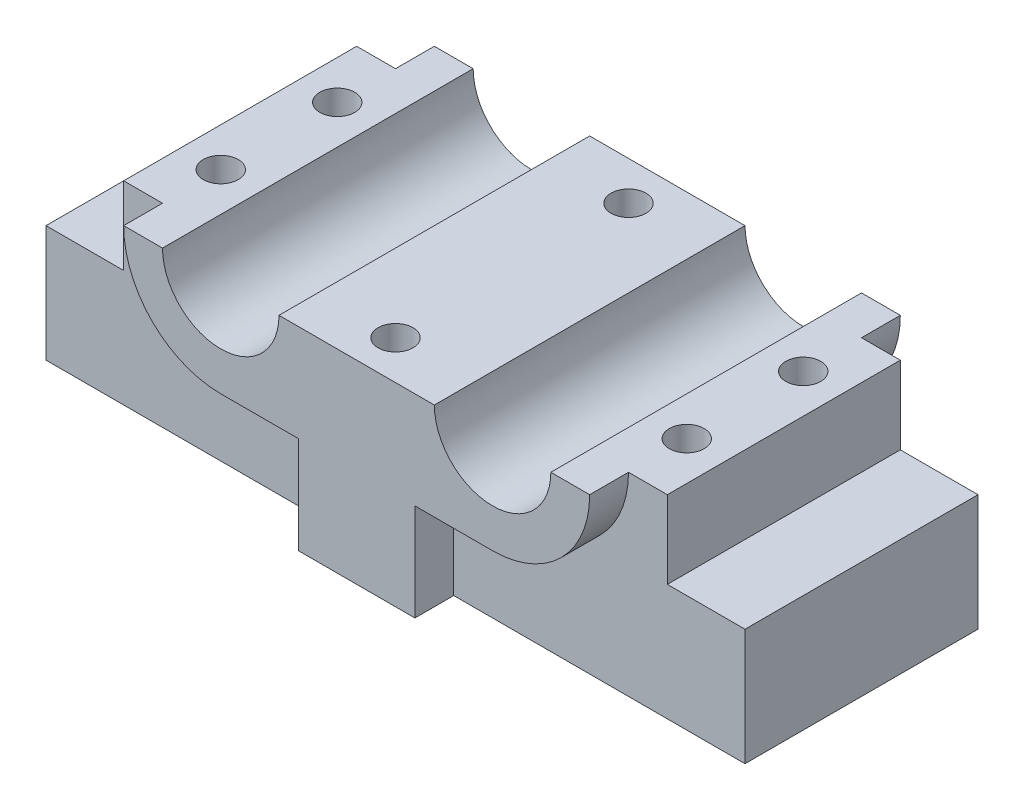
ISO-10303-21;
HEADER;
FILE_DESCRIPTION(('STEP AP214'),'2;1');
FILE_NAME('part.step','',(''),(''),'','','');
FILE_SCHEMA(('AUTOMOTIVE_DESIGN { 1 0 10303 214 1 1 1 1 }'));
ENDSEC;
DATA;
#1=APPLICATION_CONTEXT('core data for automotive mechanical design processes');
#2=APPLICATION_PROTOCOL_DEFINITION('international standard','automotive_design',2000,#1);
#3=PRODUCT_CONTEXT('',#1,'mechanical');
#4=PRODUCT('Part','Part','',(#3));
#5=PRODUCT_RELATED_PRODUCT_CATEGORY('part','',(#4));
#6=PRODUCT_DEFINITION_FORMATION('','',#4);
#7=PRODUCT_DEFINITION_CONTEXT('part definition',#1,'design');
#8=PRODUCT_DEFINITION('design','',#6,#7);
#9=PRODUCT_DEFINITION_SHAPE('','',#8);
#10=(LENGTH_UNIT() NAMED_UNIT(*) SI_UNIT(.MILLI.,.METRE.));
#11=(NAMED_UNIT(*) PLANE_ANGLE_UNIT() SI_UNIT($,.RADIAN.));
#12=(NAMED_UNIT(*) SI_UNIT($,.STERADIAN.) SOLID_ANGLE_UNIT());
#13=UNCERTAINTY_MEASURE_WITH_UNIT(LENGTH_MEASURE(1.E-05),#10,'distance_accuracy_value','');
#14=(GEOMETRIC_REPRESENTATION_CONTEXT(3) GLOBAL_UNCERTAINTY_ASSIGNED_CONTEXT((#13)) GLOBAL_UNIT_ASSIGNED_CONTEXT((#10,
#11,#12)) REPRESENTATION_CONTEXT('',''));
#15=CARTESIAN_POINT('',(0.,0.,0.));
#16=DIRECTION('',(0.,0.,1.));
#17=DIRECTION('',(1.,0.,0.));
#18=AXIS2_PLACEMENT_3D('',#15,#16,#17);
#19=CARTESIAN_POINT('',(-45.,12.5,20.));
#20=DIRECTION('',(0.,-1.,0.));
#21=DIRECTION('',(0.,0.,-1.));
#22=AXIS2_PLACEMENT_3D('',#19,#20,#21);
#23=PLANE('',#22);
#24=DIRECTION('',(-1.,0.,0.));
#25=VECTOR('',#24,1.);
#26=CARTESIAN_POINT('',(-45.,12.5,-20.));
#27=LINE('',#26,#25);
#28=CARTESIAN_POINT('',(30.,12.5,-20.));
#29=VERTEX_POINT('',#28);
#30=CARTESIAN_POINT('',(25.,12.5,-20.));
#31=VERTEX_POINT('',#30);
#32=EDGE_CURVE('E237',#29,#31,#27,.T.);
#33=ORIENTED_EDGE('',*,*,#32,.T.);
#34=DIRECTION('',(0.,0.,1.));
#35=VECTOR('',#34,1.);
#36=CARTESIAN_POINT('',(25.,12.5,-20.));
#37=LINE('',#36,#35);
#38=CARTESIAN_POINT('',(25.,12.5,20.));
#39=VERTEX_POINT('',#38);
#40=EDGE_CURVE('E222',#31,#39,#37,.T.);
#41=ORIENTED_EDGE('',*,*,#40,.T.);
#42=DIRECTION('',(-1.,0.,0.));
#43=VECTOR('',#42,1.);
#44=CARTESIAN_POINT('',(-45.,12.5,20.));
#45=LINE('',#44,#43);
#46=CARTESIAN_POINT('',(30.,12.5,20.));
#47=VERTEX_POINT('',#46);
#48=EDGE_CURVE('E279',#47,#39,#45,.T.);
#49=ORIENTED_EDGE('',*,*,#48,.F.);
#50=DIRECTION('',(0.,0.,1.));
#51=VECTOR('',#50,1.);
#52=CARTESIAN_POINT('',(30.,12.5,15.));
#53=LINE('',#52,#51);
#54=CARTESIAN_POINT('',(30.,12.5,15.));
#55=VERTEX_POINT('',#54);
#56=EDGE_CURVE('E374',#55,#47,#53,.T.);
#57=ORIENTED_EDGE('',*,*,#56,.F.);
#58=DIRECTION('',(-1.,0.,0.));
#59=VECTOR('',#58,1.);
#60=CARTESIAN_POINT('',(35.,12.5,15.));
#61=LINE('',#60,#59);
#62=CARTESIAN_POINT('',(35.,12.5,15.));
#63=VERTEX_POINT('',#62);
#64=EDGE_CURVE('E268',#63,#55,#61,.T.);
#65=ORIENTED_EDGE('',*,*,#64,.F.);
#66=DIRECTION('',(0.,0.,1.));
#67=VECTOR('',#66,1.);
#68=CARTESIAN_POINT('',(35.,12.5,-20.));
#69=LINE('',#68,#67);
#70=CARTESIAN_POINT('',(35.,12.5,-15.));
#71=VERTEX_POINT('',#70);
#72=EDGE_CURVE('E272',#71,#63,#69,.T.);
#73=ORIENTED_EDGE('',*,*,#72,.F.);
#74=DIRECTION('',(-1.,0.,0.));
#75=VECTOR('',#74,1.);
#76=CARTESIAN_POINT('',(35.,12.5,-15.));
#77=LINE('',#76,#75);
#78=CARTESIAN_POINT('',(30.,12.5,-15.));
#79=VERTEX_POINT('',#78);
#80=EDGE_CURVE('E328',#71,#79,#77,.T.);
#81=ORIENTED_EDGE('',*,*,#80,.T.);
#82=DIRECTION('',(0.,0.,-1.));
#83=VECTOR('',#82,1.);
#84=CARTESIAN_POINT('',(30.,12.5,-15.));
#85=LINE('',#84,#83);
#86=EDGE_CURVE('E246',#79,#29,#85,.T.);
#87=ORIENTED_EDGE('',*,*,#86,.T.);
#88=EDGE_LOOP('',(#33,#41,#49,#57,#65,#73,#81,#87));
#89=FACE_BOUND('',#88,.T.);
#90=CARTESIAN_POINT('',(30.,12.5,7.5));
#91=DIRECTION('',(0.,1.,0.));
#92=DIRECTION('',(0.,0.,1.));
#93=AXIS2_PLACEMENT_3D('',#90,#91,#92);
#94=CIRCLE('',#93,2.24999999999998);
#95=CARTESIAN_POINT('',(30.,12.5,9.74999999999998));
#96=VERTEX_POINT('',#95);
#97=EDGE_CURVE('E566',#96,#96,#94,.T.);
#98=ORIENTED_EDGE('',*,*,#97,.F.);
#99=EDGE_LOOP('',(#98));
#100=FACE_BOUND('',#99,.T.);
#101=CARTESIAN_POINT('',(30.,12.5,-7.5));
#102=DIRECTION('',(0.,1.,0.));
#103=DIRECTION('',(0.,0.,1.));
#104=AXIS2_PLACEMENT_3D('',#101,#102,#103);
#105=CIRCLE('',#104,2.24999999999999);
#106=CARTESIAN_POINT('',(30.,12.5,-5.25000000000001));
#107=VERTEX_POINT('',#106);
#108=EDGE_CURVE('E555',#107,#107,#105,.T.);
#109=ORIENTED_EDGE('',*,*,#108,.F.);
#110=EDGE_LOOP('',(#109));
#111=FACE_BOUND('',#110,.T.);
#112=ADVANCED_FACE('F39',(#89,#100,#111),#23,.F.);
#113=CARTESIAN_POINT('',(0.,12.5,-15.));
#114=DIRECTION('',(0.,1.,0.));
#115=DIRECTION('',(0.,0.,1.));
#116=AXIS2_PLACEMENT_3D('',#113,#114,#115);
#117=CIRCLE('',#116,2.24999999999999);
#118=CARTESIAN_POINT('',(0.,12.5,-12.75));
#119=VERTEX_POINT('',#118);
#120=EDGE_CURVE('E669',#119,#119,#117,.T.);
#121=ORIENTED_EDGE('',*,*,#120,.F.);
#122=EDGE_LOOP('',(#121));
#123=FACE_BOUND('',#122,.T.);
#124=CARTESIAN_POINT('',(0.,12.5,15.));
#125=DIRECTION('',(0.,1.,0.));
#126=DIRECTION('',(0.,0.,1.));
#127=AXIS2_PLACEMENT_3D('',#124,#125,#126);
#128=CIRCLE('',#127,2.24999999999999);
#129=CARTESIAN_POINT('',(0.,12.5,17.25));
#130=VERTEX_POINT('',#129);
#131=EDGE_CURVE('E663',#130,#130,#128,.T.);
#132=ORIENTED_EDGE('',*,*,#131,.F.);
#133=EDGE_LOOP('',(#132));
#134=FACE_BOUND('',#133,.T.);
#135=CARTESIAN_POINT('',(9.99999999999999,12.5,20.));
#136=VERTEX_POINT('',#135);
#137=CARTESIAN_POINT('',(-10.,12.5,20.));
#138=VERTEX_POINT('',#137);
#139=EDGE_CURVE('E281',#136,#138,#45,.T.);
#140=ORIENTED_EDGE('',*,*,#139,.F.);
#141=DIRECTION('',(0.,0.,1.));
#142=VECTOR('',#141,1.);
#143=CARTESIAN_POINT('',(10.,12.5,-20.));
#144=LINE('',#143,#142);
#145=CARTESIAN_POINT('',(10.,12.5,-20.));
#146=VERTEX_POINT('',#145);
#147=EDGE_CURVE('E62',#146,#136,#144,.T.);
#148=ORIENTED_EDGE('',*,*,#147,.F.);
#149=CARTESIAN_POINT('',(-10.,12.5,-20.));
#150=VERTEX_POINT('',#149);
#151=EDGE_CURVE('E240',#146,#150,#27,.T.);
#152=ORIENTED_EDGE('',*,*,#151,.T.);
#153=DIRECTION('',(0.,0.,1.));
#154=VECTOR('',#153,1.);
#155=CARTESIAN_POINT('',(-10.,12.5,-20.));
#156=LINE('',#155,#154);
#157=EDGE_CURVE('E449',#150,#138,#156,.T.);
#158=ORIENTED_EDGE('',*,*,#157,.T.);
#159=EDGE_LOOP('',(#140,#148,#152,#158));
#160=FACE_BOUND('',#159,.T.);
#161=ADVANCED_FACE('F448',(#123,#134,#160),#23,.F.);
#162=CARTESIAN_POINT('',(-30.,12.5,-7.5));
#163=DIRECTION('',(0.,1.,0.));
#164=DIRECTION('',(0.,0.,1.));
#165=AXIS2_PLACEMENT_3D('',#162,#163,#164);
#166=CIRCLE('',#165,2.24999999999999);
#167=CARTESIAN_POINT('',(-30.,12.5,-5.25000000000001));
#168=VERTEX_POINT('',#167);
#169=EDGE_CURVE('E546',#168,#168,#166,.T.);
#170=ORIENTED_EDGE('',*,*,#169,.F.);
#171=EDGE_LOOP('',(#170));
#172=FACE_BOUND('',#171,.T.);
#173=CARTESIAN_POINT('',(-30.,12.5,7.5));
#174=DIRECTION('',(0.,1.,0.));
#175=DIRECTION('',(0.,0.,1.));
#176=AXIS2_PLACEMENT_3D('',#173,#174,#175);
#177=CIRCLE('',#176,2.24999999999999);
#178=CARTESIAN_POINT('',(-30.,12.5,9.74999999999999));
#179=VERTEX_POINT('',#178);
#180=EDGE_CURVE('E549',#179,#179,#177,.T.);
#181=ORIENTED_EDGE('',*,*,#180,.F.);
#182=EDGE_LOOP('',(#181));
#183=FACE_BOUND('',#182,.T.);
#184=CARTESIAN_POINT('',(-25.,12.5,20.));
#185=VERTEX_POINT('',#184);
#186=CARTESIAN_POINT('',(-30.,12.5,20.));
#187=VERTEX_POINT('',#186);
#188=EDGE_CURVE('E251',#185,#187,#45,.T.);
#189=ORIENTED_EDGE('',*,*,#188,.F.);
#190=DIRECTION('',(0.,0.,1.));
#191=VECTOR('',#190,1.);
#192=CARTESIAN_POINT('',(-25.,12.5,-20.));
#193=LINE('',#192,#191);
#194=CARTESIAN_POINT('',(-25.,12.5,-20.));
#195=VERTEX_POINT('',#194);
#196=EDGE_CURVE('E54',#195,#185,#193,.T.);
#197=ORIENTED_EDGE('',*,*,#196,.F.);
#198=CARTESIAN_POINT('',(-30.,12.5,-20.));
#199=VERTEX_POINT('',#198);
#200=EDGE_CURVE('E249',#195,#199,#27,.T.);
#201=ORIENTED_EDGE('',*,*,#200,.T.);
#202=DIRECTION('',(0.,0.,-1.));
#203=VECTOR('',#202,1.);
#204=CARTESIAN_POINT('',(-30.,12.5,-15.));
#205=LINE('',#204,#203);
#206=CARTESIAN_POINT('',(-30.,12.5,-15.));
#207=VERTEX_POINT('',#206);
#208=EDGE_CURVE('E383',#207,#199,#205,.T.);
#209=ORIENTED_EDGE('',*,*,#208,.F.);
#210=DIRECTION('',(-1.,0.,0.));
#211=VECTOR('',#210,1.);
#212=CARTESIAN_POINT('',(0.,12.5,-15.));
#213=LINE('',#212,#211);
#214=CARTESIAN_POINT('',(-35.,12.5,-15.));
#215=VERTEX_POINT('',#214);
#216=EDGE_CURVE('E479',#207,#215,#213,.T.);
#217=ORIENTED_EDGE('',*,*,#216,.T.);
#218=DIRECTION('',(0.,0.,1.));
#219=VECTOR('',#218,1.);
#220=CARTESIAN_POINT('',(-35.,12.5,-20.));
#221=LINE('',#220,#219);
#222=CARTESIAN_POINT('',(-35.,12.5,15.));
#223=VERTEX_POINT('',#222);
#224=EDGE_CURVE('E254',#215,#223,#221,.T.);
#225=ORIENTED_EDGE('',*,*,#224,.T.);
#226=DIRECTION('',(-1.,0.,0.));
#227=VECTOR('',#226,1.);
#228=CARTESIAN_POINT('',(0.,12.5,15.));
#229=LINE('',#228,#227);
#230=CARTESIAN_POINT('',(-30.,12.5,15.));
#231=VERTEX_POINT('',#230);
#232=EDGE_CURVE('E339',#231,#223,#229,.T.);
#233=ORIENTED_EDGE('',*,*,#232,.F.);
#234=DIRECTION('',(0.,0.,1.));
#235=VECTOR('',#234,1.);
#236=CARTESIAN_POINT('',(-30.,12.5,15.));
#237=LINE('',#236,#235);
#238=EDGE_CURVE('E357',#231,#187,#237,.T.);
#239=ORIENTED_EDGE('',*,*,#238,.T.);
#240=EDGE_LOOP('',(#189,#197,#201,#209,#217,#225,#233,#239));
#241=FACE_BOUND('',#240,.T.);
#242=ADVANCED_FACE('F442',(#172,#183,#241),#23,.F.);
#243=CARTESIAN_POINT('',(-45.,12.5,20.));
#244=DIRECTION('',(1.,0.,0.));
#245=DIRECTION('',(0.,1.,0.));
#246=AXIS2_PLACEMENT_3D('',#243,#244,#245);
#247=PLANE('',#246);
#248=DIRECTION('',(0.,-1.,0.));
#249=VECTOR('',#248,1.);
#250=CARTESIAN_POINT('',(-45.,0.,-15.));
#251=LINE('',#250,#249);
#252=CARTESIAN_POINT('',(-45.,2.49999999999999,-15.));
#253=VERTEX_POINT('',#252);
#254=CARTESIAN_POINT('',(-45.,-12.5,-15.));
#255=VERTEX_POINT('',#254);
#256=EDGE_CURVE('E470',#253,#255,#251,.T.);
#257=ORIENTED_EDGE('',*,*,#256,.T.);
#258=DIRECTION('',(0.,0.,-1.));
#259=VECTOR('',#258,1.);
#260=CARTESIAN_POINT('',(-45.,-12.5,20.));
#261=LINE('',#260,#259);
#262=CARTESIAN_POINT('',(-45.,-12.5,15.));
#263=VERTEX_POINT('',#262);
#264=EDGE_CURVE('E11',#263,#255,#261,.T.);
#265=ORIENTED_EDGE('',*,*,#264,.F.);
#266=DIRECTION('',(0.,-1.,0.));
#267=VECTOR('',#266,1.);
#268=CARTESIAN_POINT('',(-45.,0.,15.));
#269=LINE('',#268,#267);
#270=CARTESIAN_POINT('',(-45.,2.49999999999999,15.));
#271=VERTEX_POINT('',#270);
#272=EDGE_CURVE('E348',#271,#263,#269,.T.);
#273=ORIENTED_EDGE('',*,*,#272,.F.);
#274=DIRECTION('',(0.,0.,1.));
#275=VECTOR('',#274,1.);
#276=CARTESIAN_POINT('',(-45.,2.49999999999999,-20.));
#277=LINE('',#276,#275);
#278=EDGE_CURVE('E265',#253,#271,#277,.T.);
#279=ORIENTED_EDGE('',*,*,#278,.F.);
#280=EDGE_LOOP('',(#257,#265,#273,#279));
#281=FACE_BOUND('',#280,.T.);
#282=ADVANCED_FACE('F536',(#281),#247,.F.);
#283=CARTESIAN_POINT('',(-45.,-12.5,20.));
#284=DIRECTION('',(0.,1.,0.));
#285=DIRECTION('',(0.,0.,1.));
#286=AXIS2_PLACEMENT_3D('',#283,#284,#285);
#287=PLANE('',#286);
#288=CARTESIAN_POINT('',(0.,-12.5,-15.));
#289=DIRECTION('',(0.,1.,0.));
#290=DIRECTION('',(0.,0.,1.));
#291=AXIS2_PLACEMENT_3D('',#288,#289,#290);
#292=CIRCLE('',#291,2.25);
#293=CARTESIAN_POINT('',(0.,-12.5,-12.75));
#294=VERTEX_POINT('',#293);
#295=EDGE_CURVE('E650',#294,#294,#292,.T.);
#296=ORIENTED_EDGE('',*,*,#295,.T.);
#297=EDGE_LOOP('',(#296));
#298=FACE_BOUND('',#297,.T.);
#299=CARTESIAN_POINT('',(0.,-12.5,15.));
#300=DIRECTION('',(0.,1.,0.));
#301=DIRECTION('',(0.,0.,1.));
#302=AXIS2_PLACEMENT_3D('',#299,#300,#301);
#303=CIRCLE('',#302,2.25);
#304=CARTESIAN_POINT('',(0.,-12.5,17.25));
#305=VERTEX_POINT('',#304);
#306=EDGE_CURVE('E654',#305,#305,#303,.T.);
#307=ORIENTED_EDGE('',*,*,#306,.T.);
#308=EDGE_LOOP('',(#307));
#309=FACE_BOUND('',#308,.T.);
#310=CARTESIAN_POINT('',(-30.,-12.5,-7.5));
#311=DIRECTION('',(0.,1.,0.));
#312=DIRECTION('',(0.,0.,1.));
#313=AXIS2_PLACEMENT_3D('',#310,#311,#312);
#314=CIRCLE('',#313,2.25);
#315=CARTESIAN_POINT('',(-30.,-12.5,-5.25));
#316=VERTEX_POINT('',#315);
#317=EDGE_CURVE('E552',#316,#316,#314,.T.);
#318=ORIENTED_EDGE('',*,*,#317,.T.);
#319=EDGE_LOOP('',(#318));
#320=FACE_BOUND('',#319,.T.);
#321=CARTESIAN_POINT('',(-30.,-12.5,7.5));
#322=DIRECTION('',(0.,1.,0.));
#323=DIRECTION('',(0.,0.,1.));
#324=AXIS2_PLACEMENT_3D('',#321,#322,#323);
#325=CIRCLE('',#324,2.25);
#326=CARTESIAN_POINT('',(-30.,-12.5,9.75));
#327=VERTEX_POINT('',#326);
#328=EDGE_CURVE('E551',#327,#327,#325,.T.);
#329=ORIENTED_EDGE('',*,*,#328,.T.);
#330=EDGE_LOOP('',(#329));
#331=FACE_BOUND('',#330,.T.);
#332=CARTESIAN_POINT('',(30.,-12.5,-7.5));
#333=DIRECTION('',(0.,1.,0.));
#334=DIRECTION('',(0.,0.,1.));
#335=AXIS2_PLACEMENT_3D('',#332,#333,#334);
#336=CIRCLE('',#335,2.25);
#337=CARTESIAN_POINT('',(30.,-12.5,-5.25));
#338=VERTEX_POINT('',#337);
#339=EDGE_CURVE('E563',#338,#338,#336,.T.);
#340=ORIENTED_EDGE('',*,*,#339,.T.);
#341=EDGE_LOOP('',(#340));
#342=FACE_BOUND('',#341,.T.);
#343=CARTESIAN_POINT('',(30.,-12.5,7.5));
#344=DIRECTION('',(0.,1.,0.));
#345=DIRECTION('',(0.,0.,1.));
#346=AXIS2_PLACEMENT_3D('',#343,#344,#345);
#347=CIRCLE('',#346,2.25);
#348=CARTESIAN_POINT('',(30.,-12.5,9.75));
#349=VERTEX_POINT('',#348);
#350=EDGE_CURVE('E453',#349,#349,#347,.T.);
#351=ORIENTED_EDGE('',*,*,#350,.T.);
#352=EDGE_LOOP('',(#351));
#353=FACE_BOUND('',#352,.T.);
#354=DIRECTION('',(1.,0.,0.));
#355=VECTOR('',#354,1.);
#356=CARTESIAN_POINT('',(0.,-12.5,-15.));
#357=LINE('',#356,#355);
#358=CARTESIAN_POINT('',(-7.5,-12.5,-15.));
#359=VERTEX_POINT('',#358);
#360=EDGE_CURVE('E468',#255,#359,#357,.T.);
#361=ORIENTED_EDGE('',*,*,#360,.T.);
#362=DIRECTION('',(0.,0.,-1.));
#363=VECTOR('',#362,1.);
#364=CARTESIAN_POINT('',(-7.5,-12.5,-15.));
#365=LINE('',#364,#363);
#366=CARTESIAN_POINT('',(-7.5,-12.5,-20.));
#367=VERTEX_POINT('',#366);
#368=EDGE_CURVE('E488',#359,#367,#365,.T.);
#369=ORIENTED_EDGE('',*,*,#368,.T.);
#370=DIRECTION('',(1.,0.,0.));
#371=VECTOR('',#370,1.);
#372=CARTESIAN_POINT('',(-45.,-12.5,-20.));
#373=LINE('',#372,#371);
#374=CARTESIAN_POINT('',(7.5,-12.5,-20.));
#375=VERTEX_POINT('',#374);
#376=EDGE_CURVE('E247',#367,#375,#373,.T.);
#377=ORIENTED_EDGE('',*,*,#376,.T.);
#378=DIRECTION('',(0.,0.,-1.));
#379=VECTOR('',#378,1.);
#380=CARTESIAN_POINT('',(7.5,-12.5,-15.));
#381=LINE('',#380,#379);
#382=CARTESIAN_POINT('',(7.5,-12.5,-15.));
#383=VERTEX_POINT('',#382);
#384=EDGE_CURVE('E306',#383,#375,#381,.T.);
#385=ORIENTED_EDGE('',*,*,#384,.F.);
#386=DIRECTION('',(1.,0.,0.));
#387=VECTOR('',#386,1.);
#388=CARTESIAN_POINT('',(7.5,-12.5,-15.));
#389=LINE('',#388,#387);
#390=CARTESIAN_POINT('',(45.,-12.5,-15.));
#391=VERTEX_POINT('',#390);
#392=EDGE_CURVE('E305',#383,#391,#389,.T.);
#393=ORIENTED_EDGE('',*,*,#392,.T.);
#394=DIRECTION('',(0.,0.,-1.));
#395=VECTOR('',#394,1.);
#396=CARTESIAN_POINT('',(45.,-12.5,20.));
#397=LINE('',#396,#395);
#398=CARTESIAN_POINT('',(45.,-12.5,15.));
#399=VERTEX_POINT('',#398);
#400=EDGE_CURVE('E47',#399,#391,#397,.T.);
#401=ORIENTED_EDGE('',*,*,#400,.F.);
#402=DIRECTION('',(1.,0.,0.));
#403=VECTOR('',#402,1.);
#404=CARTESIAN_POINT('',(7.5,-12.5,15.));
#405=LINE('',#404,#403);
#406=CARTESIAN_POINT('',(7.5,-12.5,15.));
#407=VERTEX_POINT('',#406);
#408=EDGE_CURVE('E302',#407,#399,#405,.T.);
#409=ORIENTED_EDGE('',*,*,#408,.F.);
#410=DIRECTION('',(0.,0.,1.));
#411=VECTOR('',#410,1.);
#412=CARTESIAN_POINT('',(7.5,-12.5,15.));
#413=LINE('',#412,#411);
#414=CARTESIAN_POINT('',(7.5,-12.5,20.));
#415=VERTEX_POINT('',#414);
#416=EDGE_CURVE('E381',#407,#415,#413,.T.);
#417=ORIENTED_EDGE('',*,*,#416,.T.);
#418=DIRECTION('',(1.,0.,0.));
#419=VECTOR('',#418,1.);
#420=CARTESIAN_POINT('',(-45.,-12.5,20.));
#421=LINE('',#420,#419);
#422=CARTESIAN_POINT('',(-7.5,-12.5,20.));
#423=VERTEX_POINT('',#422);
#424=EDGE_CURVE('E280',#423,#415,#421,.T.);
#425=ORIENTED_EDGE('',*,*,#424,.F.);
#426=DIRECTION('',(0.,0.,1.));
#427=VECTOR('',#426,1.);
#428=CARTESIAN_POINT('',(-7.5,-12.5,15.));
#429=LINE('',#428,#427);
#430=CARTESIAN_POINT('',(-7.5,-12.5,15.));
#431=VERTEX_POINT('',#430);
#432=EDGE_CURVE('E370',#431,#423,#429,.T.);
#433=ORIENTED_EDGE('',*,*,#432,.F.);
#434=DIRECTION('',(1.,0.,0.));
#435=VECTOR('',#434,1.);
#436=CARTESIAN_POINT('',(0.,-12.5,15.));
#437=LINE('',#436,#435);
#438=EDGE_CURVE('E350',#263,#431,#437,.T.);
#439=ORIENTED_EDGE('',*,*,#438,.F.);
#440=ORIENTED_EDGE('',*,*,#264,.T.);
#441=EDGE_LOOP('',(#361,#369,#377,#385,#393,#401,#409,#417,#425,#433,#439,#440));
#442=FACE_BOUND('',#441,.T.);
#443=ADVANCED_FACE('F300',(#298,#309,#320,#331,#342,#353,#442),#287,.F.);
#444=CARTESIAN_POINT('',(-35.,12.5,-20.));
#445=DIRECTION('',(1.,0.,0.));
#446=DIRECTION('',(0.,0.,-1.));
#447=AXIS2_PLACEMENT_3D('',#444,#445,#446);
#448=PLANE('',#447);
#449=DIRECTION('',(0.,-1.,0.));
#450=VECTOR('',#449,1.);
#451=CARTESIAN_POINT('',(-35.,0.,-15.));
#452=LINE('',#451,#450);
#453=CARTESIAN_POINT('',(-35.,2.49999999999999,-15.));
#454=VERTEX_POINT('',#453);
#455=EDGE_CURVE('E476',#215,#454,#452,.T.);
#456=ORIENTED_EDGE('',*,*,#455,.T.);
#457=DIRECTION('',(0.,0.,1.));
#458=VECTOR('',#457,1.);
#459=CARTESIAN_POINT('',(-35.,2.49999999999999,-20.));
#460=LINE('',#459,#458);
#461=CARTESIAN_POINT('',(-35.,2.49999999999999,15.));
#462=VERTEX_POINT('',#461);
#463=EDGE_CURVE('E259',#454,#462,#460,.T.);
#464=ORIENTED_EDGE('',*,*,#463,.T.);
#465=DIRECTION('',(0.,-1.,0.));
#466=VECTOR('',#465,1.);
#467=CARTESIAN_POINT('',(-35.,0.,15.));
#468=LINE('',#467,#466);
#469=EDGE_CURVE('E342',#223,#462,#468,.T.);
#470=ORIENTED_EDGE('',*,*,#469,.F.);
#471=ORIENTED_EDGE('',*,*,#224,.F.);
#472=EDGE_LOOP('',(#456,#464,#470,#471));
#473=FACE_BOUND('',#472,.T.);
#474=ADVANCED_FACE('F627',(#473),#448,.F.);
#475=CARTESIAN_POINT('',(-45.,2.49999999999999,-20.));
#476=DIRECTION('',(0.,-1.,0.));
#477=DIRECTION('',(0.,0.,-1.));
#478=AXIS2_PLACEMENT_3D('',#475,#476,#477);
#479=PLANE('',#478);
#480=DIRECTION('',(-1.,0.,0.));
#481=VECTOR('',#480,1.);
#482=CARTESIAN_POINT('',(0.,2.49999999999999,-15.));
#483=LINE('',#482,#481);
#484=EDGE_CURVE('E473',#454,#253,#483,.T.);
#485=ORIENTED_EDGE('',*,*,#484,.T.);
#486=ORIENTED_EDGE('',*,*,#278,.T.);
#487=DIRECTION('',(-1.,0.,0.));
#488=VECTOR('',#487,1.);
#489=CARTESIAN_POINT('',(0.,2.49999999999999,15.));
#490=LINE('',#489,#488);
#491=EDGE_CURVE('E345',#462,#271,#490,.T.);
#492=ORIENTED_EDGE('',*,*,#491,.F.);
#493=ORIENTED_EDGE('',*,*,#463,.F.);
#494=EDGE_LOOP('',(#485,#486,#492,#493));
#495=FACE_BOUND('',#494,.T.);
#496=ADVANCED_FACE('F630',(#495),#479,.F.);
#497=CARTESIAN_POINT('',(0.,0.,-20.));
#498=DIRECTION('',(0.,0.,1.));
#499=DIRECTION('',(1.,0.,0.));
#500=AXIS2_PLACEMENT_3D('',#497,#498,#499);
#501=PLANE('',#500);
#502=ORIENTED_EDGE('',*,*,#151,.F.);
#503=CARTESIAN_POINT('',(17.5,12.5,-20.));
#504=DIRECTION('',(0.,0.,1.));
#505=DIRECTION('',(1.,0.,0.));
#506=AXIS2_PLACEMENT_3D('',#503,#504,#505);
#507=CIRCLE('',#506,7.5);
#508=EDGE_CURVE('E225',#146,#31,#507,.T.);
#509=ORIENTED_EDGE('',*,*,#508,.T.);
#510=ORIENTED_EDGE('',*,*,#32,.F.);
#511=CARTESIAN_POINT('',(17.5,12.5,-20.));
#512=DIRECTION('',(0.,0.,-1.));
#513=DIRECTION('',(-1.,0.,0.));
#514=AXIS2_PLACEMENT_3D('',#511,#512,#513);
#515=CIRCLE('',#514,12.5);
#516=CARTESIAN_POINT('',(17.5,0.,-20.));
#517=VERTEX_POINT('',#516);
#518=EDGE_CURVE('E326',#29,#517,#515,.T.);
#519=ORIENTED_EDGE('',*,*,#518,.T.);
#520=DIRECTION('',(-1.,0.,0.));
#521=VECTOR('',#520,1.);
#522=CARTESIAN_POINT('',(17.5,0.,-20.));
#523=LINE('',#522,#521);
#524=CARTESIAN_POINT('',(7.5,0.,-20.));
#525=VERTEX_POINT('',#524);
#526=EDGE_CURVE('E323',#517,#525,#523,.T.);
#527=ORIENTED_EDGE('',*,*,#526,.T.);
#528=DIRECTION('',(0.,-1.,0.));
#529=VECTOR('',#528,1.);
#530=CARTESIAN_POINT('',(7.5,0.,-20.));
#531=LINE('',#530,#529);
#532=EDGE_CURVE('E320',#525,#375,#531,.T.);
#533=ORIENTED_EDGE('',*,*,#532,.T.);
#534=ORIENTED_EDGE('',*,*,#376,.F.);
#535=DIRECTION('',(0.,-1.,0.));
#536=VECTOR('',#535,1.);
#537=CARTESIAN_POINT('',(-7.5,0.,-20.));
#538=LINE('',#537,#536);
#539=CARTESIAN_POINT('',(-7.5,0.,-20.));
#540=VERTEX_POINT('',#539);
#541=EDGE_CURVE('E462',#540,#367,#538,.T.);
#542=ORIENTED_EDGE('',*,*,#541,.F.);
#543=DIRECTION('',(1.,0.,0.));
#544=VECTOR('',#543,1.);
#545=CARTESIAN_POINT('',(0.,0.,-20.));
#546=LINE('',#545,#544);
#547=CARTESIAN_POINT('',(-17.5,0.,-20.));
#548=VERTEX_POINT('',#547);
#549=EDGE_CURVE('E483',#548,#540,#546,.T.);
#550=ORIENTED_EDGE('',*,*,#549,.F.);
#551=CARTESIAN_POINT('',(-17.5,12.5,-20.));
#552=DIRECTION('',(0.,0.,1.));
#553=DIRECTION('',(1.,0.,0.));
#554=AXIS2_PLACEMENT_3D('',#551,#552,#553);
#555=CIRCLE('',#554,12.5);
#556=EDGE_CURVE('E330',#199,#548,#555,.T.);
#557=ORIENTED_EDGE('',*,*,#556,.F.);
#558=ORIENTED_EDGE('',*,*,#200,.F.);
#559=CARTESIAN_POINT('',(-17.5,12.5,-20.));
#560=DIRECTION('',(0.,0.,1.));
#561=DIRECTION('',(1.,0.,0.));
#562=AXIS2_PLACEMENT_3D('',#559,#560,#561);
#563=CIRCLE('',#562,7.5);
#564=EDGE_CURVE('E450',#195,#150,#563,.T.);
#565=ORIENTED_EDGE('',*,*,#564,.T.);
#566=EDGE_LOOP('',(#502,#509,#510,#519,#527,#533,#534,#542,#550,#557,#558,#565));
#567=FACE_BOUND('',#566,.T.);
#568=ADVANCED_FACE('F235',(#567),#501,.F.);
#569=CARTESIAN_POINT('',(0.,0.,20.));
#570=DIRECTION('',(0.,0.,1.));
#571=DIRECTION('',(1.,0.,0.));
#572=AXIS2_PLACEMENT_3D('',#569,#570,#571);
#573=PLANE('',#572);
#574=CARTESIAN_POINT('',(17.5,12.5,20.));
#575=DIRECTION('',(0.,0.,1.));
#576=DIRECTION('',(1.,0.,0.));
#577=AXIS2_PLACEMENT_3D('',#574,#575,#576);
#578=CIRCLE('',#577,7.5);
#579=EDGE_CURVE('E226',#136,#39,#578,.T.);
#580=ORIENTED_EDGE('',*,*,#579,.F.);
#581=ORIENTED_EDGE('',*,*,#139,.T.);
#582=CARTESIAN_POINT('',(-17.5,12.5,20.));
#583=DIRECTION('',(0.,0.,1.));
#584=DIRECTION('',(1.,0.,0.));
#585=AXIS2_PLACEMENT_3D('',#582,#583,#584);
#586=CIRCLE('',#585,7.5);
#587=EDGE_CURVE('E445',#185,#138,#586,.T.);
#588=ORIENTED_EDGE('',*,*,#587,.F.);
#589=ORIENTED_EDGE('',*,*,#188,.T.);
#590=CARTESIAN_POINT('',(-17.5,12.5,20.));
#591=DIRECTION('',(0.,0.,1.));
#592=DIRECTION('',(1.,0.,0.));
#593=AXIS2_PLACEMENT_3D('',#590,#591,#592);
#594=CIRCLE('',#593,12.5);
#595=CARTESIAN_POINT('',(-17.5,0.,20.));
#596=VERTEX_POINT('',#595);
#597=EDGE_CURVE('E358',#187,#596,#594,.T.);
#598=ORIENTED_EDGE('',*,*,#597,.T.);
#599=DIRECTION('',(1.,0.,0.));
#600=VECTOR('',#599,1.);
#601=CARTESIAN_POINT('',(0.,0.,20.));
#602=LINE('',#601,#600);
#603=CARTESIAN_POINT('',(-7.5,0.,20.));
#604=VERTEX_POINT('',#603);
#605=EDGE_CURVE('E340',#596,#604,#602,.T.);
#606=ORIENTED_EDGE('',*,*,#605,.T.);
#607=DIRECTION('',(0.,-1.,0.));
#608=VECTOR('',#607,1.);
#609=CARTESIAN_POINT('',(-7.5,0.,20.));
#610=LINE('',#609,#608);
#611=EDGE_CURVE('E361',#604,#423,#610,.T.);
#612=ORIENTED_EDGE('',*,*,#611,.T.);
#613=ORIENTED_EDGE('',*,*,#424,.T.);
#614=DIRECTION('',(0.,-1.,0.));
#615=VECTOR('',#614,1.);
#616=CARTESIAN_POINT('',(7.5,0.,20.));
#617=LINE('',#616,#615);
#618=CARTESIAN_POINT('',(7.5,0.,20.));
#619=VERTEX_POINT('',#618);
#620=EDGE_CURVE('E384',#619,#415,#617,.T.);
#621=ORIENTED_EDGE('',*,*,#620,.F.);
#622=DIRECTION('',(-1.,0.,0.));
#623=VECTOR('',#622,1.);
#624=CARTESIAN_POINT('',(17.5,0.,20.));
#625=LINE('',#624,#623);
#626=CARTESIAN_POINT('',(17.5,0.,20.));
#627=VERTEX_POINT('',#626);
#628=EDGE_CURVE('E386',#627,#619,#625,.T.);
#629=ORIENTED_EDGE('',*,*,#628,.F.);
#630=CARTESIAN_POINT('',(17.5,12.5,20.));
#631=DIRECTION('',(0.,0.,-1.));
#632=DIRECTION('',(-1.,0.,0.));
#633=AXIS2_PLACEMENT_3D('',#630,#631,#632);
#634=CIRCLE('',#633,12.5);
#635=EDGE_CURVE('E362',#47,#627,#634,.T.);
#636=ORIENTED_EDGE('',*,*,#635,.F.);
#637=ORIENTED_EDGE('',*,*,#48,.T.);
#638=EDGE_LOOP('',(#580,#581,#588,#589,#598,#606,#612,#613,#621,#629,#636,#637));
#639=FACE_BOUND('',#638,.T.);
#640=ADVANCED_FACE('F416',(#639),#573,.T.);
#641=CARTESIAN_POINT('',(45.,12.5,20.));
#642=DIRECTION('',(-1.,0.,0.));
#643=DIRECTION('',(0.,0.,1.));
#644=AXIS2_PLACEMENT_3D('',#641,#642,#643);
#645=PLANE('',#644);
#646=ORIENTED_EDGE('',*,*,#400,.T.);
#647=DIRECTION('',(0.,1.,0.));
#648=VECTOR('',#647,1.);
#649=CARTESIAN_POINT('',(45.,-12.5,-15.));
#650=LINE('',#649,#648);
#651=CARTESIAN_POINT('',(45.,2.5,-15.));
#652=VERTEX_POINT('',#651);
#653=EDGE_CURVE('E292',#391,#652,#650,.T.);
#654=ORIENTED_EDGE('',*,*,#653,.T.);
#655=DIRECTION('',(0.,0.,1.));
#656=VECTOR('',#655,1.);
#657=CARTESIAN_POINT('',(45.,2.5,-20.));
#658=LINE('',#657,#656);
#659=CARTESIAN_POINT('',(45.,2.5,15.));
#660=VERTEX_POINT('',#659);
#661=EDGE_CURVE('E276',#652,#660,#658,.T.);
#662=ORIENTED_EDGE('',*,*,#661,.T.);
#663=DIRECTION('',(0.,1.,0.));
#664=VECTOR('',#663,1.);
#665=CARTESIAN_POINT('',(45.,-12.5,15.));
#666=LINE('',#665,#664);
#667=EDGE_CURVE('E295',#399,#660,#666,.T.);
#668=ORIENTED_EDGE('',*,*,#667,.F.);
#669=EDGE_LOOP('',(#646,#654,#662,#668));
#670=FACE_BOUND('',#669,.T.);
#671=ADVANCED_FACE('F41',(#670),#645,.F.);
#672=CARTESIAN_POINT('',(45.,2.5,-20.));
#673=DIRECTION('',(0.,-1.,0.));
#674=DIRECTION('',(1.,0.,0.));
#675=AXIS2_PLACEMENT_3D('',#672,#673,#674);
#676=PLANE('',#675);
#677=ORIENTED_EDGE('',*,*,#661,.F.);
#678=DIRECTION('',(-1.,0.,0.));
#679=VECTOR('',#678,1.);
#680=CARTESIAN_POINT('',(45.,2.5,-15.));
#681=LINE('',#680,#679);
#682=CARTESIAN_POINT('',(35.,2.5,-15.));
#683=VERTEX_POINT('',#682);
#684=EDGE_CURVE('E313',#652,#683,#681,.T.);
#685=ORIENTED_EDGE('',*,*,#684,.T.);
#686=DIRECTION('',(0.,0.,1.));
#687=VECTOR('',#686,1.);
#688=CARTESIAN_POINT('',(35.,2.5,-20.));
#689=LINE('',#688,#687);
#690=CARTESIAN_POINT('',(35.,2.5,15.));
#691=VERTEX_POINT('',#690);
#692=EDGE_CURVE('E274',#683,#691,#689,.T.);
#693=ORIENTED_EDGE('',*,*,#692,.T.);
#694=DIRECTION('',(-1.,0.,0.));
#695=VECTOR('',#694,1.);
#696=CARTESIAN_POINT('',(45.,2.5,15.));
#697=LINE('',#696,#695);
#698=EDGE_CURVE('E393',#660,#691,#697,.T.);
#699=ORIENTED_EDGE('',*,*,#698,.F.);
#700=EDGE_LOOP('',(#677,#685,#693,#699));
#701=FACE_BOUND('',#700,.T.);
#702=ADVANCED_FACE('F501',(#701),#676,.F.);
#703=CARTESIAN_POINT('',(35.,12.5,-20.));
#704=DIRECTION('',(-1.,0.,0.));
#705=DIRECTION('',(0.,0.,1.));
#706=AXIS2_PLACEMENT_3D('',#703,#704,#705);
#707=PLANE('',#706);
#708=ORIENTED_EDGE('',*,*,#692,.F.);
#709=DIRECTION('',(0.,1.,0.));
#710=VECTOR('',#709,1.);
#711=CARTESIAN_POINT('',(35.,2.5,-15.));
#712=LINE('',#711,#710);
#713=EDGE_CURVE('E496',#683,#71,#712,.T.);
#714=ORIENTED_EDGE('',*,*,#713,.T.);
#715=ORIENTED_EDGE('',*,*,#72,.T.);
#716=DIRECTION('',(0.,1.,0.));
#717=VECTOR('',#716,1.);
#718=CARTESIAN_POINT('',(35.,2.5,15.));
#719=LINE('',#718,#717);
#720=EDGE_CURVE('E376',#691,#63,#719,.T.);
#721=ORIENTED_EDGE('',*,*,#720,.F.);
#722=EDGE_LOOP('',(#708,#714,#715,#721));
#723=FACE_BOUND('',#722,.T.);
#724=ADVANCED_FACE('F504',(#723),#707,.F.);
#725=CARTESIAN_POINT('',(-17.5,12.5,15.));
#726=DIRECTION('',(0.,0.,1.));
#727=DIRECTION('',(1.,0.,0.));
#728=AXIS2_PLACEMENT_3D('',#725,#726,#727);
#729=CYLINDRICAL_SURFACE('',#728,12.5);
#730=ORIENTED_EDGE('',*,*,#597,.F.);
#731=ORIENTED_EDGE('',*,*,#238,.F.);
#732=CARTESIAN_POINT('',(-17.5,12.5,15.));
#733=DIRECTION('',(0.,0.,1.));
#734=DIRECTION('',(1.,0.,0.));
#735=AXIS2_PLACEMENT_3D('',#732,#733,#734);
#736=CIRCLE('',#735,12.5);
#737=CARTESIAN_POINT('',(-17.5,0.,15.));
#738=VERTEX_POINT('',#737);
#739=EDGE_CURVE('E336',#231,#738,#736,.T.);
#740=ORIENTED_EDGE('',*,*,#739,.T.);
#741=DIRECTION('',(0.,0.,1.));
#742=VECTOR('',#741,1.);
#743=CARTESIAN_POINT('',(-17.5,0.,15.));
#744=LINE('',#743,#742);
#745=EDGE_CURVE('E278',#738,#596,#744,.T.);
#746=ORIENTED_EDGE('',*,*,#745,.T.);
#747=EDGE_LOOP('',(#730,#731,#740,#746));
#748=FACE_BOUND('',#747,.T.);
#749=ADVANCED_FACE('F436',(#748),#729,.T.);
#750=CARTESIAN_POINT('',(0.,0.,15.));
#751=DIRECTION('',(0.,-1.,0.));
#752=DIRECTION('',(1.,0.,0.));
#753=AXIS2_PLACEMENT_3D('',#750,#751,#752);
#754=PLANE('',#753);
#755=ORIENTED_EDGE('',*,*,#605,.F.);
#756=ORIENTED_EDGE('',*,*,#745,.F.);
#757=DIRECTION('',(1.,0.,0.));
#758=VECTOR('',#757,1.);
#759=CARTESIAN_POINT('',(0.,0.,15.));
#760=LINE('',#759,#758);
#761=CARTESIAN_POINT('',(-7.5,0.,15.));
#762=VERTEX_POINT('',#761);
#763=EDGE_CURVE('E355',#738,#762,#760,.T.);
#764=ORIENTED_EDGE('',*,*,#763,.T.);
#765=DIRECTION('',(0.,0.,1.));
#766=VECTOR('',#765,1.);
#767=CARTESIAN_POINT('',(-7.5,0.,15.));
#768=LINE('',#767,#766);
#769=EDGE_CURVE('E368',#762,#604,#768,.T.);
#770=ORIENTED_EDGE('',*,*,#769,.T.);
#771=EDGE_LOOP('',(#755,#756,#764,#770));
#772=FACE_BOUND('',#771,.T.);
#773=ADVANCED_FACE('F434',(#772),#754,.T.);
#774=CARTESIAN_POINT('',(-7.5,0.,15.));
#775=DIRECTION('',(-1.,0.,0.));
#776=DIRECTION('',(0.,0.,1.));
#777=AXIS2_PLACEMENT_3D('',#774,#775,#776);
#778=PLANE('',#777);
#779=ORIENTED_EDGE('',*,*,#611,.F.);
#780=ORIENTED_EDGE('',*,*,#769,.F.);
#781=DIRECTION('',(0.,-1.,0.));
#782=VECTOR('',#781,1.);
#783=CARTESIAN_POINT('',(-7.5,0.,15.));
#784=LINE('',#783,#782);
#785=EDGE_CURVE('E353',#762,#431,#784,.T.);
#786=ORIENTED_EDGE('',*,*,#785,.T.);
#787=ORIENTED_EDGE('',*,*,#432,.T.);
#788=EDGE_LOOP('',(#779,#780,#786,#787));
#789=FACE_BOUND('',#788,.T.);
#790=ADVANCED_FACE('F428',(#789),#778,.T.);
#791=CARTESIAN_POINT('',(0.,0.,15.));
#792=DIRECTION('',(0.,0.,1.));
#793=DIRECTION('',(1.,0.,0.));
#794=AXIS2_PLACEMENT_3D('',#791,#792,#793);
#795=PLANE('',#794);
#796=ORIENTED_EDGE('',*,*,#739,.F.);
#797=ORIENTED_EDGE('',*,*,#232,.T.);
#798=ORIENTED_EDGE('',*,*,#469,.T.);
#799=ORIENTED_EDGE('',*,*,#491,.T.);
#800=ORIENTED_EDGE('',*,*,#272,.T.);
#801=ORIENTED_EDGE('',*,*,#438,.T.);
#802=ORIENTED_EDGE('',*,*,#785,.F.);
#803=ORIENTED_EDGE('',*,*,#763,.F.);
#804=EDGE_LOOP('',(#796,#797,#798,#799,#800,#801,#802,#803));
#805=FACE_BOUND('',#804,.T.);
#806=ADVANCED_FACE('F439',(#805),#795,.T.);
#807=CARTESIAN_POINT('',(7.5,0.,15.));
#808=DIRECTION('',(-1.,0.,0.));
#809=DIRECTION('',(0.,0.,1.));
#810=AXIS2_PLACEMENT_3D('',#807,#808,#809);
#811=PLANE('',#810);
#812=ORIENTED_EDGE('',*,*,#620,.T.);
#813=ORIENTED_EDGE('',*,*,#416,.F.);
#814=DIRECTION('',(0.,-1.,0.));
#815=VECTOR('',#814,1.);
#816=CARTESIAN_POINT('',(7.5,0.,15.));
#817=LINE('',#816,#815);
#818=CARTESIAN_POINT('',(7.5,0.,15.));
#819=VERTEX_POINT('',#818);
#820=EDGE_CURVE('E398',#819,#407,#817,.T.);
#821=ORIENTED_EDGE('',*,*,#820,.F.);
#822=DIRECTION('',(0.,0.,1.));
#823=VECTOR('',#822,1.);
#824=CARTESIAN_POINT('',(7.5,0.,15.));
#825=LINE('',#824,#823);
#826=EDGE_CURVE('E379',#819,#619,#825,.T.);
#827=ORIENTED_EDGE('',*,*,#826,.T.);
#828=EDGE_LOOP('',(#812,#813,#821,#827));
#829=FACE_BOUND('',#828,.T.);
#830=ADVANCED_FACE('F422',(#829),#811,.F.);
#831=CARTESIAN_POINT('',(17.5,0.,15.));
#832=DIRECTION('',(0.,1.,0.));
#833=DIRECTION('',(-1.,0.,0.));
#834=AXIS2_PLACEMENT_3D('',#831,#832,#833);
#835=PLANE('',#834);
#836=ORIENTED_EDGE('',*,*,#628,.T.);
#837=ORIENTED_EDGE('',*,*,#826,.F.);
#838=DIRECTION('',(-1.,0.,0.));
#839=VECTOR('',#838,1.);
#840=CARTESIAN_POINT('',(17.5,0.,15.));
#841=LINE('',#840,#839);
#842=CARTESIAN_POINT('',(17.5,0.,15.));
#843=VERTEX_POINT('',#842);
#844=EDGE_CURVE('E401',#843,#819,#841,.T.);
#845=ORIENTED_EDGE('',*,*,#844,.F.);
#846=DIRECTION('',(0.,0.,1.));
#847=VECTOR('',#846,1.);
#848=CARTESIAN_POINT('',(17.5,0.,15.));
#849=LINE('',#848,#847);
#850=EDGE_CURVE('E377',#843,#627,#849,.T.);
#851=ORIENTED_EDGE('',*,*,#850,.T.);
#852=EDGE_LOOP('',(#836,#837,#845,#851));
#853=FACE_BOUND('',#852,.T.);
#854=ADVANCED_FACE('F418',(#853),#835,.F.);
#855=CARTESIAN_POINT('',(17.5,12.5,15.));
#856=DIRECTION('',(0.,0.,1.));
#857=DIRECTION('',(1.,0.,0.));
#858=AXIS2_PLACEMENT_3D('',#855,#856,#857);
#859=CYLINDRICAL_SURFACE('',#858,12.5);
#860=ORIENTED_EDGE('',*,*,#635,.T.);
#861=ORIENTED_EDGE('',*,*,#850,.F.);
#862=CARTESIAN_POINT('',(17.5,12.5,15.));
#863=DIRECTION('',(0.,0.,-1.));
#864=DIRECTION('',(-1.,0.,0.));
#865=AXIS2_PLACEMENT_3D('',#862,#863,#864);
#866=CIRCLE('',#865,12.5);
#867=EDGE_CURVE('E403',#55,#843,#866,.T.);
#868=ORIENTED_EDGE('',*,*,#867,.F.);
#869=ORIENTED_EDGE('',*,*,#56,.T.);
#870=EDGE_LOOP('',(#860,#861,#868,#869));
#871=FACE_BOUND('',#870,.T.);
#872=ADVANCED_FACE('F414',(#871),#859,.T.);
#873=CARTESIAN_POINT('',(17.5,12.5,15.));
#874=DIRECTION('',(0.,0.,-1.));
#875=DIRECTION('',(-1.,0.,0.));
#876=AXIS2_PLACEMENT_3D('',#873,#874,#875);
#877=PLANE('',#876);
#878=ORIENTED_EDGE('',*,*,#64,.T.);
#879=ORIENTED_EDGE('',*,*,#867,.T.);
#880=ORIENTED_EDGE('',*,*,#844,.T.);
#881=ORIENTED_EDGE('',*,*,#820,.T.);
#882=ORIENTED_EDGE('',*,*,#408,.T.);
#883=ORIENTED_EDGE('',*,*,#667,.T.);
#884=ORIENTED_EDGE('',*,*,#698,.T.);
#885=ORIENTED_EDGE('',*,*,#720,.T.);
#886=EDGE_LOOP('',(#878,#879,#880,#881,#882,#883,#884,#885));
#887=FACE_BOUND('',#886,.T.);
#888=ADVANCED_FACE('F409',(#887),#877,.F.);
#889=CARTESIAN_POINT('',(17.5,12.5,-15.));
#890=DIRECTION('',(0.,0.,-1.));
#891=DIRECTION('',(-1.,0.,0.));
#892=AXIS2_PLACEMENT_3D('',#889,#890,#891);
#893=CYLINDRICAL_SURFACE('',#892,12.5);
#894=ORIENTED_EDGE('',*,*,#518,.F.);
#895=ORIENTED_EDGE('',*,*,#86,.F.);
#896=CARTESIAN_POINT('',(17.5,12.5,-15.));
#897=DIRECTION('',(0.,0.,-1.));
#898=DIRECTION('',(-1.,0.,0.));
#899=AXIS2_PLACEMENT_3D('',#896,#897,#898);
#900=CIRCLE('',#899,12.5);
#901=CARTESIAN_POINT('',(17.5,0.,-15.));
#902=VERTEX_POINT('',#901);
#903=EDGE_CURVE('E318',#79,#902,#900,.T.);
#904=ORIENTED_EDGE('',*,*,#903,.T.);
#905=DIRECTION('',(0.,0.,-1.));
#906=VECTOR('',#905,1.);
#907=CARTESIAN_POINT('',(17.5,0.,-15.));
#908=LINE('',#907,#906);
#909=EDGE_CURVE('E331',#902,#517,#908,.T.);
#910=ORIENTED_EDGE('',*,*,#909,.T.);
#911=EDGE_LOOP('',(#894,#895,#904,#910));
#912=FACE_BOUND('',#911,.T.);
#913=ADVANCED_FACE('F509',(#912),#893,.T.);
#914=CARTESIAN_POINT('',(17.5,0.,-15.));
#915=DIRECTION('',(0.,-1.,0.));
#916=DIRECTION('',(1.,0.,0.));
#917=AXIS2_PLACEMENT_3D('',#914,#915,#916);
#918=PLANE('',#917);
#919=ORIENTED_EDGE('',*,*,#526,.F.);
#920=ORIENTED_EDGE('',*,*,#909,.F.);
#921=DIRECTION('',(-1.,0.,0.));
#922=VECTOR('',#921,1.);
#923=CARTESIAN_POINT('',(17.5,0.,-15.));
#924=LINE('',#923,#922);
#925=CARTESIAN_POINT('',(7.5,0.,-15.));
#926=VERTEX_POINT('',#925);
#927=EDGE_CURVE('E311',#902,#926,#924,.T.);
#928=ORIENTED_EDGE('',*,*,#927,.T.);
#929=DIRECTION('',(0.,0.,-1.));
#930=VECTOR('',#929,1.);
#931=CARTESIAN_POINT('',(7.5,0.,-15.));
#932=LINE('',#931,#930);
#933=EDGE_CURVE('E333',#926,#525,#932,.T.);
#934=ORIENTED_EDGE('',*,*,#933,.T.);
#935=EDGE_LOOP('',(#919,#920,#928,#934));
#936=FACE_BOUND('',#935,.T.);
#937=ADVANCED_FACE('F514',(#936),#918,.T.);
#938=CARTESIAN_POINT('',(7.5,0.,-15.));
#939=DIRECTION('',(1.,0.,0.));
#940=DIRECTION('',(0.,0.,-1.));
#941=AXIS2_PLACEMENT_3D('',#938,#939,#940);
#942=PLANE('',#941);
#943=ORIENTED_EDGE('',*,*,#532,.F.);
#944=ORIENTED_EDGE('',*,*,#933,.F.);
#945=DIRECTION('',(0.,-1.,0.));
#946=VECTOR('',#945,1.);
#947=CARTESIAN_POINT('',(7.5,0.,-15.));
#948=LINE('',#947,#946);
#949=EDGE_CURVE('E309',#926,#383,#948,.T.);
#950=ORIENTED_EDGE('',*,*,#949,.T.);
#951=ORIENTED_EDGE('',*,*,#384,.T.);
#952=EDGE_LOOP('',(#943,#944,#950,#951));
#953=FACE_BOUND('',#952,.T.);
#954=ADVANCED_FACE('F517',(#953),#942,.T.);
#955=CARTESIAN_POINT('',(17.5,12.5,-15.));
#956=DIRECTION('',(0.,0.,1.));
#957=DIRECTION('',(-1.,0.,0.));
#958=AXIS2_PLACEMENT_3D('',#955,#956,#957);
#959=PLANE('',#958);
#960=ORIENTED_EDGE('',*,*,#80,.F.);
#961=ORIENTED_EDGE('',*,*,#713,.F.);
#962=ORIENTED_EDGE('',*,*,#684,.F.);
#963=ORIENTED_EDGE('',*,*,#653,.F.);
#964=ORIENTED_EDGE('',*,*,#392,.F.);
#965=ORIENTED_EDGE('',*,*,#949,.F.);
#966=ORIENTED_EDGE('',*,*,#927,.F.);
#967=ORIENTED_EDGE('',*,*,#903,.F.);
#968=EDGE_LOOP('',(#960,#961,#962,#963,#964,#965,#966,#967));
#969=FACE_BOUND('',#968,.T.);
#970=ADVANCED_FACE('F505',(#969),#959,.F.);
#971=CARTESIAN_POINT('',(-17.5,12.5,-15.));
#972=DIRECTION('',(0.,0.,-1.));
#973=DIRECTION('',(-1.,0.,0.));
#974=AXIS2_PLACEMENT_3D('',#971,#972,#973);
#975=CYLINDRICAL_SURFACE('',#974,12.5);
#976=ORIENTED_EDGE('',*,*,#556,.T.);
#977=DIRECTION('',(0.,0.,-1.));
#978=VECTOR('',#977,1.);
#979=CARTESIAN_POINT('',(-17.5,0.,-15.));
#980=LINE('',#979,#978);
#981=CARTESIAN_POINT('',(-17.5,0.,-15.));
#982=VERTEX_POINT('',#981);
#983=EDGE_CURVE('E481',#982,#548,#980,.T.);
#984=ORIENTED_EDGE('',*,*,#983,.F.);
#985=CARTESIAN_POINT('',(-17.5,12.5,-15.));
#986=DIRECTION('',(0.,0.,1.));
#987=DIRECTION('',(1.,0.,0.));
#988=AXIS2_PLACEMENT_3D('',#985,#986,#987);
#989=CIRCLE('',#988,12.5);
#990=EDGE_CURVE('E458',#207,#982,#989,.T.);
#991=ORIENTED_EDGE('',*,*,#990,.F.);
#992=ORIENTED_EDGE('',*,*,#208,.T.);
#993=EDGE_LOOP('',(#976,#984,#991,#992));
#994=FACE_BOUND('',#993,.T.);
#995=ADVANCED_FACE('F524',(#994),#975,.T.);
#996=CARTESIAN_POINT('',(-7.5,0.,-15.));
#997=DIRECTION('',(1.,0.,0.));
#998=DIRECTION('',(0.,0.,-1.));
#999=AXIS2_PLACEMENT_3D('',#996,#997,#998);
#1000=PLANE('',#999);
#1001=ORIENTED_EDGE('',*,*,#541,.T.);
#1002=ORIENTED_EDGE('',*,*,#368,.F.);
#1003=DIRECTION('',(0.,-1.,0.));
#1004=VECTOR('',#1003,1.);
#1005=CARTESIAN_POINT('',(-7.5,0.,-15.));
#1006=LINE('',#1005,#1004);
#1007=CARTESIAN_POINT('',(-7.5,0.,-15.));
#1008=VERTEX_POINT('',#1007);
#1009=EDGE_CURVE('E465',#1008,#359,#1006,.T.);
#1010=ORIENTED_EDGE('',*,*,#1009,.F.);
#1011=DIRECTION('',(0.,0.,-1.));
#1012=VECTOR('',#1011,1.);
#1013=CARTESIAN_POINT('',(-7.5,0.,-15.));
#1014=LINE('',#1013,#1012);
#1015=EDGE_CURVE('E491',#1008,#540,#1014,.T.);
#1016=ORIENTED_EDGE('',*,*,#1015,.T.);
#1017=EDGE_LOOP('',(#1001,#1002,#1010,#1016));
#1018=FACE_BOUND('',#1017,.T.);
#1019=ADVANCED_FACE('F604',(#1018),#1000,.F.);
#1020=CARTESIAN_POINT('',(0.,0.,-15.));
#1021=DIRECTION('',(0.,1.,0.));
#1022=DIRECTION('',(-1.,0.,0.));
#1023=AXIS2_PLACEMENT_3D('',#1020,#1021,#1022);
#1024=PLANE('',#1023);
#1025=ORIENTED_EDGE('',*,*,#549,.T.);
#1026=ORIENTED_EDGE('',*,*,#1015,.F.);
#1027=DIRECTION('',(1.,0.,0.));
#1028=VECTOR('',#1027,1.);
#1029=CARTESIAN_POINT('',(0.,0.,-15.));
#1030=LINE('',#1029,#1028);
#1031=EDGE_CURVE('E461',#982,#1008,#1030,.T.);
#1032=ORIENTED_EDGE('',*,*,#1031,.F.);
#1033=ORIENTED_EDGE('',*,*,#983,.T.);
#1034=EDGE_LOOP('',(#1025,#1026,#1032,#1033));
#1035=FACE_BOUND('',#1034,.T.);
#1036=ADVANCED_FACE('F602',(#1035),#1024,.F.);
#1037=CARTESIAN_POINT('',(0.,0.,-15.));
#1038=DIRECTION('',(0.,0.,-1.));
#1039=DIRECTION('',(1.,0.,0.));
#1040=AXIS2_PLACEMENT_3D('',#1037,#1038,#1039);
#1041=PLANE('',#1040);
#1042=ORIENTED_EDGE('',*,*,#990,.T.);
#1043=ORIENTED_EDGE('',*,*,#1031,.T.);
#1044=ORIENTED_EDGE('',*,*,#1009,.T.);
#1045=ORIENTED_EDGE('',*,*,#360,.F.);
#1046=ORIENTED_EDGE('',*,*,#256,.F.);
#1047=ORIENTED_EDGE('',*,*,#484,.F.);
#1048=ORIENTED_EDGE('',*,*,#455,.F.);
#1049=ORIENTED_EDGE('',*,*,#216,.F.);
#1050=EDGE_LOOP('',(#1042,#1043,#1044,#1045,#1046,#1047,#1048,#1049));
#1051=FACE_BOUND('',#1050,.T.);
#1052=ADVANCED_FACE('F599',(#1051),#1041,.T.);
#1053=CARTESIAN_POINT('',(-17.5,12.5,-20.));
#1054=DIRECTION('',(0.,0.,1.));
#1055=DIRECTION('',(1.,0.,0.));
#1056=AXIS2_PLACEMENT_3D('',#1053,#1054,#1055);
#1057=CYLINDRICAL_SURFACE('',#1056,7.5);
#1058=ORIENTED_EDGE('',*,*,#587,.T.);
#1059=ORIENTED_EDGE('',*,*,#157,.F.);
#1060=ORIENTED_EDGE('',*,*,#564,.F.);
#1061=ORIENTED_EDGE('',*,*,#196,.T.);
#1062=EDGE_LOOP('',(#1058,#1059,#1060,#1061));
#1063=FACE_BOUND('',#1062,.T.);
#1064=ADVANCED_FACE('F596',(#1063),#1057,.F.);
#1065=CARTESIAN_POINT('',(17.5,12.5,-20.));
#1066=DIRECTION('',(0.,0.,1.));
#1067=DIRECTION('',(1.,0.,0.));
#1068=AXIS2_PLACEMENT_3D('',#1065,#1066,#1067);
#1069=CYLINDRICAL_SURFACE('',#1068,7.5);
#1070=ORIENTED_EDGE('',*,*,#579,.T.);
#1071=ORIENTED_EDGE('',*,*,#40,.F.);
#1072=ORIENTED_EDGE('',*,*,#508,.F.);
#1073=ORIENTED_EDGE('',*,*,#147,.T.);
#1074=EDGE_LOOP('',(#1070,#1071,#1072,#1073));
#1075=FACE_BOUND('',#1074,.T.);
#1076=ADVANCED_FACE('F224',(#1075),#1069,.F.);
#1077=CARTESIAN_POINT('',(30.,12.5,7.5));
#1078=DIRECTION('',(0.,1.,0.));
#1079=DIRECTION('',(0.,0.,1.));
#1080=AXIS2_PLACEMENT_3D('',#1077,#1078,#1079);
#1081=CYLINDRICAL_SURFACE('',#1080,2.24999999999999);
#1082=ORIENTED_EDGE('',*,*,#350,.F.);
#1083=EDGE_LOOP('',(#1082));
#1084=FACE_BOUND('',#1083,.T.);
#1085=ORIENTED_EDGE('',*,*,#97,.T.);
#1086=EDGE_LOOP('',(#1085));
#1087=FACE_BOUND('',#1086,.T.);
#1088=ADVANCED_FACE('F574',(#1084,#1087),#1081,.F.);
#1089=CARTESIAN_POINT('',(30.,12.5,-7.5));
#1090=DIRECTION('',(0.,1.,0.));
#1091=DIRECTION('',(0.,0.,1.));
#1092=AXIS2_PLACEMENT_3D('',#1089,#1090,#1091);
#1093=CYLINDRICAL_SURFACE('',#1092,2.24999999999999);
#1094=ORIENTED_EDGE('',*,*,#339,.F.);
#1095=EDGE_LOOP('',(#1094));
#1096=FACE_BOUND('',#1095,.T.);
#1097=ORIENTED_EDGE('',*,*,#108,.T.);
#1098=EDGE_LOOP('',(#1097));
#1099=FACE_BOUND('',#1098,.T.);
#1100=ADVANCED_FACE('F576',(#1096,#1099),#1093,.F.);
#1101=CARTESIAN_POINT('',(-30.,12.5,7.5));
#1102=DIRECTION('',(0.,1.,0.));
#1103=DIRECTION('',(0.,0.,1.));
#1104=AXIS2_PLACEMENT_3D('',#1101,#1102,#1103);
#1105=CYLINDRICAL_SURFACE('',#1104,2.24999999999999);
#1106=ORIENTED_EDGE('',*,*,#328,.F.);
#1107=EDGE_LOOP('',(#1106));
#1108=FACE_BOUND('',#1107,.T.);
#1109=ORIENTED_EDGE('',*,*,#180,.T.);
#1110=EDGE_LOOP('',(#1109));
#1111=FACE_BOUND('',#1110,.T.);
#1112=ADVANCED_FACE('F582',(#1108,#1111),#1105,.F.);
#1113=CARTESIAN_POINT('',(-30.,12.5,-7.5));
#1114=DIRECTION('',(0.,1.,0.));
#1115=DIRECTION('',(0.,0.,1.));
#1116=AXIS2_PLACEMENT_3D('',#1113,#1114,#1115);
#1117=CYLINDRICAL_SURFACE('',#1116,2.24999999999999);
#1118=ORIENTED_EDGE('',*,*,#317,.F.);
#1119=EDGE_LOOP('',(#1118));
#1120=FACE_BOUND('',#1119,.T.);
#1121=ORIENTED_EDGE('',*,*,#169,.T.);
#1122=EDGE_LOOP('',(#1121));
#1123=FACE_BOUND('',#1122,.T.);
#1124=ADVANCED_FACE('F588',(#1120,#1123),#1117,.F.);
#1125=CARTESIAN_POINT('',(0.,12.5,15.));
#1126=DIRECTION('',(0.,1.,0.));
#1127=DIRECTION('',(0.,0.,1.));
#1128=AXIS2_PLACEMENT_3D('',#1125,#1126,#1127);
#1129=CYLINDRICAL_SURFACE('',#1128,2.24999999999999);
#1130=ORIENTED_EDGE('',*,*,#306,.F.);
#1131=EDGE_LOOP('',(#1130));
#1132=FACE_BOUND('',#1131,.T.);
#1133=ORIENTED_EDGE('',*,*,#131,.T.);
#1134=EDGE_LOOP('',(#1133));
#1135=FACE_BOUND('',#1134,.T.);
#1136=ADVANCED_FACE('F662',(#1132,#1135),#1129,.F.);
#1137=CARTESIAN_POINT('',(0.,12.5,-15.));
#1138=DIRECTION('',(0.,1.,0.));
#1139=DIRECTION('',(0.,0.,1.));
#1140=AXIS2_PLACEMENT_3D('',#1137,#1138,#1139);
#1141=CYLINDRICAL_SURFACE('',#1140,2.24999999999999);
#1142=ORIENTED_EDGE('',*,*,#295,.F.);
#1143=EDGE_LOOP('',(#1142));
#1144=FACE_BOUND('',#1143,.T.);
#1145=ORIENTED_EDGE('',*,*,#120,.T.);
#1146=EDGE_LOOP('',(#1145));
#1147=FACE_BOUND('',#1146,.T.);
#1148=ADVANCED_FACE('F673',(#1144,#1147),#1141,.F.);
#1149=CLOSED_SHELL('',(#112,#161,#242,#282,#443,#474,#496,#568,#640,#671,#702,#724,#749,#773,
#790,#806,#830,#854,#872,#888,#913,#937,#954,#970,#995,#1019,#1036,#1052,#1064,#1076,#1088,
#1100,#1112,#1124,#1136,#1148));
#1150=MANIFOLD_SOLID_BREP('B2',#1149);
#1151=ADVANCED_BREP_SHAPE_REPRESENTATION('',(#18,#1150),#14);
#1152=SHAPE_DEFINITION_REPRESENTATION(#9,#1151);
ENDSEC;
END-ISO-10303-21;
